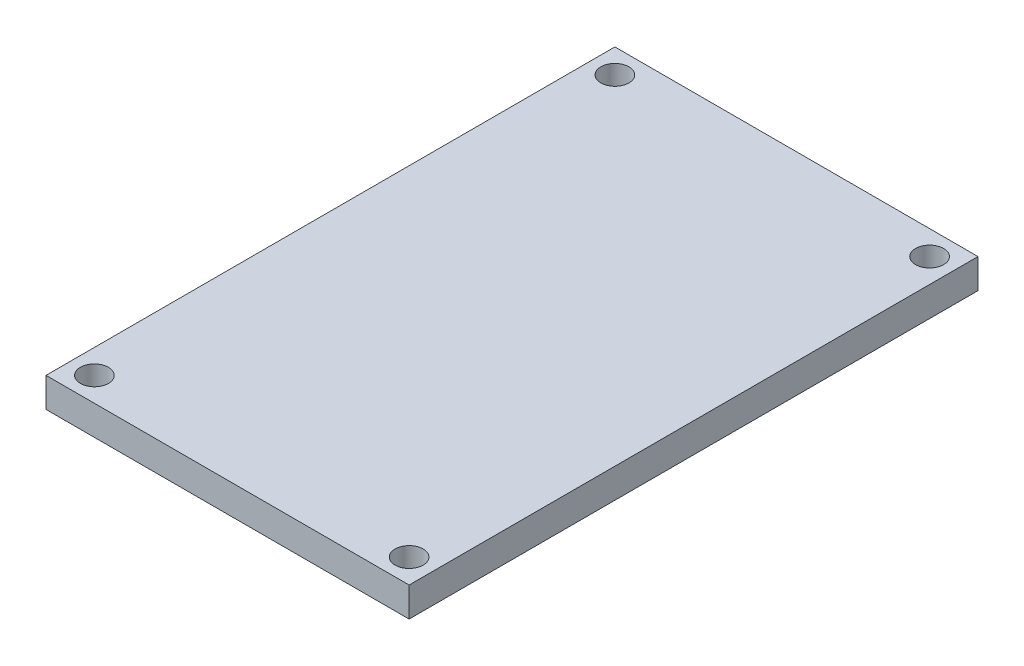
ISO-10303-21;
HEADER;
FILE_DESCRIPTION(('STEP AP214'),'2;1');
FILE_NAME('part.step','',(''),(''),'','','');
FILE_SCHEMA(('AUTOMOTIVE_DESIGN { 1 0 10303 214 1 1 1 1 }'));
ENDSEC;
DATA;
#1=APPLICATION_CONTEXT('core data for automotive mechanical design processes');
#2=APPLICATION_PROTOCOL_DEFINITION('international standard','automotive_design',2000,#1);
#3=PRODUCT_CONTEXT('',#1,'mechanical');
#4=PRODUCT('Part','Part','',(#3));
#5=PRODUCT_RELATED_PRODUCT_CATEGORY('part','',(#4));
#6=PRODUCT_DEFINITION_FORMATION('','',#4);
#7=PRODUCT_DEFINITION_CONTEXT('part definition',#1,'design');
#8=PRODUCT_DEFINITION('design','',#6,#7);
#9=PRODUCT_DEFINITION_SHAPE('','',#8);
#10=(LENGTH_UNIT() NAMED_UNIT(*) SI_UNIT(.MILLI.,.METRE.));
#11=(NAMED_UNIT(*) PLANE_ANGLE_UNIT() SI_UNIT($,.RADIAN.));
#12=(NAMED_UNIT(*) SI_UNIT($,.STERADIAN.) SOLID_ANGLE_UNIT());
#13=UNCERTAINTY_MEASURE_WITH_UNIT(LENGTH_MEASURE(1.E-05),#10,'distance_accuracy_value','');
#14=(GEOMETRIC_REPRESENTATION_CONTEXT(3) GLOBAL_UNCERTAINTY_ASSIGNED_CONTEXT((#13)) GLOBAL_UNIT_ASSIGNED_CONTEXT((#10,
#11,#12)) REPRESENTATION_CONTEXT('',''));
#15=CARTESIAN_POINT('',(0.,0.,0.));
#16=DIRECTION('',(0.,0.,1.));
#17=DIRECTION('',(1.,0.,0.));
#18=AXIS2_PLACEMENT_3D('',#15,#16,#17);
#19=CARTESIAN_POINT('',(19.05,3.0988,29.845));
#20=DIRECTION('',(0.,1.,0.));
#21=DIRECTION('',(0.,0.,1.));
#22=AXIS2_PLACEMENT_3D('',#19,#20,#21);
#23=PLANE('',#22);
#24=CARTESIAN_POINT('',(-16.51,3.0988,27.305));
#25=DIRECTION('',(0.,1.,0.));
#26=DIRECTION('',(0.,0.,-1.));
#27=AXIS2_PLACEMENT_3D('',#24,#25,#26);
#28=CIRCLE('',#27,1.4732);
#29=CARTESIAN_POINT('',(-16.51,3.0988,25.8318));
#30=VERTEX_POINT('',#29);
#31=EDGE_CURVE('E150',#30,#30,#28,.T.);
#32=ORIENTED_EDGE('',*,*,#31,.F.);
#33=EDGE_LOOP('',(#32));
#34=FACE_BOUND('',#33,.T.);
#35=CARTESIAN_POINT('',(-16.51,3.0988,-27.305));
#36=DIRECTION('',(0.,1.,0.));
#37=DIRECTION('',(0.,0.,1.));
#38=AXIS2_PLACEMENT_3D('',#35,#36,#37);
#39=CIRCLE('',#38,1.4732);
#40=CARTESIAN_POINT('',(-16.51,3.0988,-25.8318));
#41=VERTEX_POINT('',#40);
#42=EDGE_CURVE('E122',#41,#41,#39,.T.);
#43=ORIENTED_EDGE('',*,*,#42,.F.);
#44=EDGE_LOOP('',(#43));
#45=FACE_BOUND('',#44,.T.);
#46=DIRECTION('',(0.,0.,-1.));
#47=VECTOR('',#46,1.);
#48=CARTESIAN_POINT('',(19.05,3.0988,-29.845));
#49=LINE('',#48,#47);
#50=CARTESIAN_POINT('',(19.05,3.0988,29.845));
#51=VERTEX_POINT('',#50);
#52=CARTESIAN_POINT('',(19.05,3.0988,-29.845));
#53=VERTEX_POINT('',#52);
#54=EDGE_CURVE('E100',#51,#53,#49,.T.);
#55=ORIENTED_EDGE('',*,*,#54,.T.);
#56=DIRECTION('',(-1.,0.,0.));
#57=VECTOR('',#56,1.);
#58=CARTESIAN_POINT('',(-19.05,3.0988,-29.845));
#59=LINE('',#58,#57);
#60=CARTESIAN_POINT('',(-19.05,3.0988,-29.845));
#61=VERTEX_POINT('',#60);
#62=EDGE_CURVE('E94',#53,#61,#59,.T.);
#63=ORIENTED_EDGE('',*,*,#62,.T.);
#64=DIRECTION('',(0.,0.,1.));
#65=VECTOR('',#64,1.);
#66=CARTESIAN_POINT('',(-19.05,3.0988,-29.845));
#67=LINE('',#66,#65);
#68=CARTESIAN_POINT('',(-19.05,3.0988,29.845));
#69=VERTEX_POINT('',#68);
#70=EDGE_CURVE('E98',#61,#69,#67,.T.);
#71=ORIENTED_EDGE('',*,*,#70,.T.);
#72=DIRECTION('',(1.,0.,0.));
#73=VECTOR('',#72,1.);
#74=CARTESIAN_POINT('',(-19.05,3.0988,29.845));
#75=LINE('',#74,#73);
#76=EDGE_CURVE('E59',#69,#51,#75,.T.);
#77=ORIENTED_EDGE('',*,*,#76,.T.);
#78=EDGE_LOOP('',(#55,#63,#71,#77));
#79=FACE_BOUND('',#78,.T.);
#80=CARTESIAN_POINT('',(16.51,3.0988,-27.305));
#81=DIRECTION('',(0.,1.,0.));
#82=DIRECTION('',(0.,0.,-1.));
#83=AXIS2_PLACEMENT_3D('',#80,#81,#82);
#84=CIRCLE('',#83,1.4732);
#85=CARTESIAN_POINT('',(16.51,3.0988,-28.7782));
#86=VERTEX_POINT('',#85);
#87=EDGE_CURVE('E142',#86,#86,#84,.T.);
#88=ORIENTED_EDGE('',*,*,#87,.F.);
#89=EDGE_LOOP('',(#88));
#90=FACE_BOUND('',#89,.T.);
#91=CARTESIAN_POINT('',(16.51,3.0988,27.305));
#92=DIRECTION('',(0.,1.,0.));
#93=DIRECTION('',(0.,0.,1.));
#94=AXIS2_PLACEMENT_3D('',#91,#92,#93);
#95=CIRCLE('',#94,1.4732);
#96=CARTESIAN_POINT('',(16.51,3.0988,28.7782));
#97=VERTEX_POINT('',#96);
#98=EDGE_CURVE('E158',#97,#97,#95,.T.);
#99=ORIENTED_EDGE('',*,*,#98,.F.);
#100=EDGE_LOOP('',(#99));
#101=FACE_BOUND('',#100,.T.);
#102=ADVANCED_FACE('F39',(#34,#45,#79,#90,#101),#23,.T.);
#103=CARTESIAN_POINT('',(19.05,0.,29.845));
#104=DIRECTION('',(0.,1.,0.));
#105=DIRECTION('',(0.,0.,1.));
#106=AXIS2_PLACEMENT_3D('',#103,#104,#105);
#107=PLANE('',#106);
#108=CARTESIAN_POINT('',(-16.51,0.,27.305));
#109=DIRECTION('',(0.,1.,0.));
#110=DIRECTION('',(0.,0.,-1.));
#111=AXIS2_PLACEMENT_3D('',#108,#109,#110);
#112=CIRCLE('',#111,1.4732);
#113=CARTESIAN_POINT('',(-16.51,0.,25.8318));
#114=VERTEX_POINT('',#113);
#115=EDGE_CURVE('E154',#114,#114,#112,.T.);
#116=ORIENTED_EDGE('',*,*,#115,.T.);
#117=EDGE_LOOP('',(#116));
#118=FACE_BOUND('',#117,.T.);
#119=CARTESIAN_POINT('',(-16.51,0.,-27.305));
#120=DIRECTION('',(0.,1.,0.));
#121=DIRECTION('',(0.,0.,1.));
#122=AXIS2_PLACEMENT_3D('',#119,#120,#121);
#123=CIRCLE('',#122,1.4732);
#124=CARTESIAN_POINT('',(-16.51,0.,-25.8318));
#125=VERTEX_POINT('',#124);
#126=EDGE_CURVE('E138',#125,#125,#123,.T.);
#127=ORIENTED_EDGE('',*,*,#126,.T.);
#128=EDGE_LOOP('',(#127));
#129=FACE_BOUND('',#128,.T.);
#130=DIRECTION('',(0.,0.,-1.));
#131=VECTOR('',#130,1.);
#132=CARTESIAN_POINT('',(19.05,0.,-29.845));
#133=LINE('',#132,#131);
#134=CARTESIAN_POINT('',(19.05,0.,29.845));
#135=VERTEX_POINT('',#134);
#136=CARTESIAN_POINT('',(19.05,0.,-29.845));
#137=VERTEX_POINT('',#136);
#138=EDGE_CURVE('E118',#135,#137,#133,.T.);
#139=ORIENTED_EDGE('',*,*,#138,.F.);
#140=DIRECTION('',(1.,0.,0.));
#141=VECTOR('',#140,1.);
#142=CARTESIAN_POINT('',(-19.05,0.,29.845));
#143=LINE('',#142,#141);
#144=CARTESIAN_POINT('',(-19.05,0.,29.845));
#145=VERTEX_POINT('',#144);
#146=EDGE_CURVE('E87',#145,#135,#143,.T.);
#147=ORIENTED_EDGE('',*,*,#146,.F.);
#148=DIRECTION('',(0.,0.,1.));
#149=VECTOR('',#148,1.);
#150=CARTESIAN_POINT('',(-19.05,0.,-29.845));
#151=LINE('',#150,#149);
#152=CARTESIAN_POINT('',(-19.05,0.,-29.845));
#153=VERTEX_POINT('',#152);
#154=EDGE_CURVE('E81',#153,#145,#151,.T.);
#155=ORIENTED_EDGE('',*,*,#154,.F.);
#156=DIRECTION('',(-1.,0.,0.));
#157=VECTOR('',#156,1.);
#158=CARTESIAN_POINT('',(-19.05,0.,-29.845));
#159=LINE('',#158,#157);
#160=EDGE_CURVE('E105',#137,#153,#159,.T.);
#161=ORIENTED_EDGE('',*,*,#160,.F.);
#162=EDGE_LOOP('',(#139,#147,#155,#161));
#163=FACE_BOUND('',#162,.T.);
#164=CARTESIAN_POINT('',(16.51,0.,-27.305));
#165=DIRECTION('',(0.,1.,0.));
#166=DIRECTION('',(0.,0.,-1.));
#167=AXIS2_PLACEMENT_3D('',#164,#165,#166);
#168=CIRCLE('',#167,1.4732);
#169=CARTESIAN_POINT('',(16.51,0.,-28.7782));
#170=VERTEX_POINT('',#169);
#171=EDGE_CURVE('E146',#170,#170,#168,.T.);
#172=ORIENTED_EDGE('',*,*,#171,.T.);
#173=EDGE_LOOP('',(#172));
#174=FACE_BOUND('',#173,.T.);
#175=CARTESIAN_POINT('',(16.51,0.,27.305));
#176=DIRECTION('',(0.,1.,0.));
#177=DIRECTION('',(0.,0.,1.));
#178=AXIS2_PLACEMENT_3D('',#175,#176,#177);
#179=CIRCLE('',#178,1.4732);
#180=CARTESIAN_POINT('',(16.51,0.,28.7782));
#181=VERTEX_POINT('',#180);
#182=EDGE_CURVE('E162',#181,#181,#179,.T.);
#183=ORIENTED_EDGE('',*,*,#182,.T.);
#184=EDGE_LOOP('',(#183));
#185=FACE_BOUND('',#184,.T.);
#186=ADVANCED_FACE('F133',(#118,#129,#163,#174,#185),#107,.F.);
#187=CARTESIAN_POINT('',(19.05,3.0988,-29.845));
#188=DIRECTION('',(-1.,0.,0.));
#189=DIRECTION('',(0.,0.,1.));
#190=AXIS2_PLACEMENT_3D('',#187,#188,#189);
#191=PLANE('',#190);
#192=ORIENTED_EDGE('',*,*,#138,.T.);
#193=DIRECTION('',(0.,-1.,0.));
#194=VECTOR('',#193,1.);
#195=CARTESIAN_POINT('',(19.05,3.0988,-29.845));
#196=LINE('',#195,#194);
#197=EDGE_CURVE('E11',#53,#137,#196,.T.);
#198=ORIENTED_EDGE('',*,*,#197,.F.);
#199=ORIENTED_EDGE('',*,*,#54,.F.);
#200=DIRECTION('',(0.,-1.,0.));
#201=VECTOR('',#200,1.);
#202=CARTESIAN_POINT('',(19.05,3.0988,29.845));
#203=LINE('',#202,#201);
#204=EDGE_CURVE('E114',#51,#135,#203,.T.);
#205=ORIENTED_EDGE('',*,*,#204,.T.);
#206=EDGE_LOOP('',(#192,#198,#199,#205));
#207=FACE_BOUND('',#206,.T.);
#208=ADVANCED_FACE('F41',(#207),#191,.F.);
#209=CARTESIAN_POINT('',(-19.05,3.0988,-29.845));
#210=DIRECTION('',(0.,0.,1.));
#211=DIRECTION('',(1.,0.,0.));
#212=AXIS2_PLACEMENT_3D('',#209,#210,#211);
#213=PLANE('',#212);
#214=ORIENTED_EDGE('',*,*,#160,.T.);
#215=DIRECTION('',(0.,-1.,0.));
#216=VECTOR('',#215,1.);
#217=CARTESIAN_POINT('',(-19.05,3.0988,-29.845));
#218=LINE('',#217,#216);
#219=EDGE_CURVE('E49',#61,#153,#218,.T.);
#220=ORIENTED_EDGE('',*,*,#219,.F.);
#221=ORIENTED_EDGE('',*,*,#62,.F.);
#222=ORIENTED_EDGE('',*,*,#197,.T.);
#223=EDGE_LOOP('',(#214,#220,#221,#222));
#224=FACE_BOUND('',#223,.T.);
#225=ADVANCED_FACE('F104',(#224),#213,.F.);
#226=CARTESIAN_POINT('',(-19.05,3.0988,-29.845));
#227=DIRECTION('',(1.,0.,0.));
#228=DIRECTION('',(0.,0.,-1.));
#229=AXIS2_PLACEMENT_3D('',#226,#227,#228);
#230=PLANE('',#229);
#231=ORIENTED_EDGE('',*,*,#154,.T.);
#232=DIRECTION('',(0.,-1.,0.));
#233=VECTOR('',#232,1.);
#234=CARTESIAN_POINT('',(-19.05,3.0988,29.845));
#235=LINE('',#234,#233);
#236=EDGE_CURVE('E107',#69,#145,#235,.T.);
#237=ORIENTED_EDGE('',*,*,#236,.F.);
#238=ORIENTED_EDGE('',*,*,#70,.F.);
#239=ORIENTED_EDGE('',*,*,#219,.T.);
#240=EDGE_LOOP('',(#231,#237,#238,#239));
#241=FACE_BOUND('',#240,.T.);
#242=ADVANCED_FACE('F108',(#241),#230,.F.);
#243=CARTESIAN_POINT('',(-19.05,3.0988,29.845));
#244=DIRECTION('',(0.,0.,-1.));
#245=DIRECTION('',(-1.,0.,0.));
#246=AXIS2_PLACEMENT_3D('',#243,#244,#245);
#247=PLANE('',#246);
#248=ORIENTED_EDGE('',*,*,#146,.T.);
#249=ORIENTED_EDGE('',*,*,#204,.F.);
#250=ORIENTED_EDGE('',*,*,#76,.F.);
#251=ORIENTED_EDGE('',*,*,#236,.T.);
#252=EDGE_LOOP('',(#248,#249,#250,#251));
#253=FACE_BOUND('',#252,.T.);
#254=ADVANCED_FACE('F130',(#253),#247,.F.);
#255=CARTESIAN_POINT('',(-16.51,3.0988,-27.305));
#256=DIRECTION('',(0.,-1.,0.));
#257=DIRECTION('',(0.,0.,-1.));
#258=AXIS2_PLACEMENT_3D('',#255,#256,#257);
#259=CYLINDRICAL_SURFACE('',#258,1.4732);
#260=ORIENTED_EDGE('',*,*,#42,.T.);
#261=EDGE_LOOP('',(#260));
#262=FACE_BOUND('',#261,.T.);
#263=ORIENTED_EDGE('',*,*,#126,.F.);
#264=EDGE_LOOP('',(#263));
#265=FACE_BOUND('',#264,.T.);
#266=ADVANCED_FACE('F184',(#262,#265),#259,.F.);
#267=CARTESIAN_POINT('',(16.51,3.0988,-27.305));
#268=DIRECTION('',(0.,-1.,0.));
#269=DIRECTION('',(0.,0.,-1.));
#270=AXIS2_PLACEMENT_3D('',#267,#268,#269);
#271=CYLINDRICAL_SURFACE('',#270,1.4732);
#272=ORIENTED_EDGE('',*,*,#87,.T.);
#273=EDGE_LOOP('',(#272));
#274=FACE_BOUND('',#273,.T.);
#275=ORIENTED_EDGE('',*,*,#171,.F.);
#276=EDGE_LOOP('',(#275));
#277=FACE_BOUND('',#276,.T.);
#278=ADVANCED_FACE('F229',(#274,#277),#271,.F.);
#279=CARTESIAN_POINT('',(-16.51,3.0988,27.305));
#280=DIRECTION('',(0.,-1.,0.));
#281=DIRECTION('',(0.,0.,-1.));
#282=AXIS2_PLACEMENT_3D('',#279,#280,#281);
#283=CYLINDRICAL_SURFACE('',#282,1.4732);
#284=ORIENTED_EDGE('',*,*,#31,.T.);
#285=EDGE_LOOP('',(#284));
#286=FACE_BOUND('',#285,.T.);
#287=ORIENTED_EDGE('',*,*,#115,.F.);
#288=EDGE_LOOP('',(#287));
#289=FACE_BOUND('',#288,.T.);
#290=ADVANCED_FACE('F217',(#286,#289),#283,.F.);
#291=CARTESIAN_POINT('',(16.51,3.0988,27.305));
#292=DIRECTION('',(0.,-1.,0.));
#293=DIRECTION('',(0.,0.,-1.));
#294=AXIS2_PLACEMENT_3D('',#291,#292,#293);
#295=CYLINDRICAL_SURFACE('',#294,1.4732);
#296=ORIENTED_EDGE('',*,*,#98,.T.);
#297=EDGE_LOOP('',(#296));
#298=FACE_BOUND('',#297,.T.);
#299=ORIENTED_EDGE('',*,*,#182,.F.);
#300=EDGE_LOOP('',(#299));
#301=FACE_BOUND('',#300,.T.);
#302=ADVANCED_FACE('F170',(#298,#301),#295,.F.);
#303=CLOSED_SHELL('',(#102,#186,#208,#225,#242,#254,#266,#278,#290,#302));
#304=MANIFOLD_SOLID_BREP('B2',#303);
#305=ADVANCED_BREP_SHAPE_REPRESENTATION('',(#18,#304),#14);
#306=SHAPE_DEFINITION_REPRESENTATION(#9,#305);
ENDSEC;
END-ISO-10303-21;
